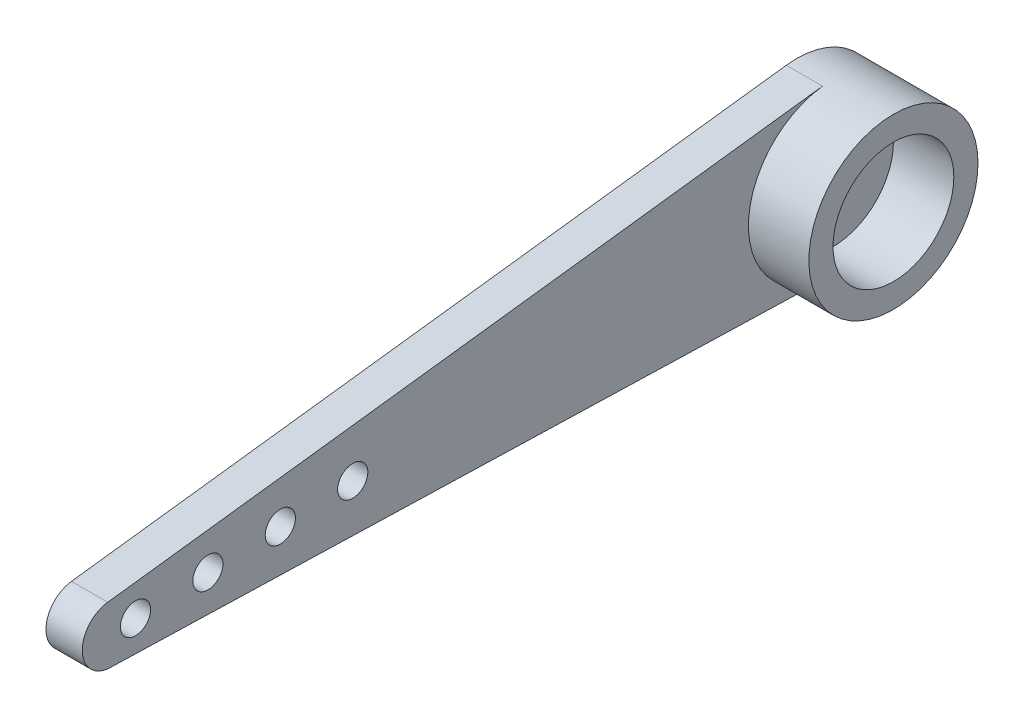
ISO-10303-21;
HEADER;
FILE_DESCRIPTION(('STEP AP214'),'2;1');
FILE_NAME('part.step','',(''),(''),'','','');
FILE_SCHEMA(('AUTOMOTIVE_DESIGN { 1 0 10303 214 1 1 1 1 }'));
ENDSEC;
DATA;
#1=APPLICATION_CONTEXT('core data for automotive mechanical design processes');
#2=APPLICATION_PROTOCOL_DEFINITION('international standard','automotive_design',2000,#1);
#3=PRODUCT_CONTEXT('',#1,'mechanical');
#4=PRODUCT('Part','Part','',(#3));
#5=PRODUCT_RELATED_PRODUCT_CATEGORY('part','',(#4));
#6=PRODUCT_DEFINITION_FORMATION('','',#4);
#7=PRODUCT_DEFINITION_CONTEXT('part definition',#1,'design');
#8=PRODUCT_DEFINITION('design','',#6,#7);
#9=PRODUCT_DEFINITION_SHAPE('','',#8);
#10=(LENGTH_UNIT() NAMED_UNIT(*) SI_UNIT(.MILLI.,.METRE.));
#11=(NAMED_UNIT(*) PLANE_ANGLE_UNIT() SI_UNIT($,.RADIAN.));
#12=(NAMED_UNIT(*) SI_UNIT($,.STERADIAN.) SOLID_ANGLE_UNIT());
#13=UNCERTAINTY_MEASURE_WITH_UNIT(LENGTH_MEASURE(1.E-05),#10,'distance_accuracy_value','');
#14=(GEOMETRIC_REPRESENTATION_CONTEXT(3) GLOBAL_UNCERTAINTY_ASSIGNED_CONTEXT((#13)) GLOBAL_UNIT_ASSIGNED_CONTEXT((#10,
#11,#12)) REPRESENTATION_CONTEXT('',''));
#15=CARTESIAN_POINT('',(0.,0.,0.));
#16=DIRECTION('',(0.,0.,1.));
#17=DIRECTION('',(1.,0.,0.));
#18=AXIS2_PLACEMENT_3D('',#15,#16,#17);
#19=CARTESIAN_POINT('',(32.7710882546416,5.20649712537169,-71.7326396745928));
#20=DIRECTION('',(0.,-0.999572249893803,0.0292458072591791));
#21=DIRECTION('',(0.,-0.0292458072591791,-0.999572249893803));
#22=AXIS2_PLACEMENT_3D('',#19,#20,#21);
#23=PLANE('',#22);
#24=DIRECTION('',(0.,-0.0292458072591791,-0.999572249893803));
#25=VECTOR('',#24,1.);
#26=CARTESIAN_POINT('',(-2.5,5.20649712537169,-71.7326396745928));
#27=LINE('',#26,#25);
#28=CARTESIAN_POINT('',(-2.5,6.08166145135119,-41.8210025433743));
#29=VERTEX_POINT('',#28);
#30=CARTESIAN_POINT('',(-2.5,5.20649712537169,-71.7326396745928));
#31=VERTEX_POINT('',#30);
#32=EDGE_CURVE('E94',#29,#31,#27,.T.);
#33=ORIENTED_EDGE('',*,*,#32,.F.);
#34=DIRECTION('',(-1.,0.,0.));
#35=VECTOR('',#34,1.);
#36=CARTESIAN_POINT('',(32.7710882546416,6.08166145135119,-41.8210025433743));
#37=LINE('',#36,#35);
#38=CARTESIAN_POINT('',(-4.,6.08166145135119,-41.8210025433743));
#39=VERTEX_POINT('',#38);
#40=EDGE_CURVE('E144',#29,#39,#37,.T.);
#41=ORIENTED_EDGE('',*,*,#40,.T.);
#42=DIRECTION('',(0.,0.0292458072591791,0.999572249893803));
#43=VECTOR('',#42,1.);
#44=CARTESIAN_POINT('',(-4.,5.20649712537169,-71.7326396745928));
#45=LINE('',#44,#43);
#46=CARTESIAN_POINT('',(-4.,5.20649712537169,-71.7326396745928));
#47=VERTEX_POINT('',#46);
#48=EDGE_CURVE('E134',#47,#39,#45,.T.);
#49=ORIENTED_EDGE('',*,*,#48,.F.);
#50=DIRECTION('',(-1.,0.,0.));
#51=VECTOR('',#50,1.);
#52=CARTESIAN_POINT('',(32.7710882546416,5.20649712537169,-71.7326396745928));
#53=LINE('',#52,#51);
#54=EDGE_CURVE('E141',#31,#47,#53,.T.);
#55=ORIENTED_EDGE('',*,*,#54,.F.);
#56=EDGE_LOOP('',(#33,#41,#49,#55));
#57=FACE_BOUND('',#56,.T.);
#58=ADVANCED_FACE('F41',(#57),#23,.T.);
#59=CARTESIAN_POINT('',(32.7710882546416,7.27675693693088,-41.9698372006076));
#60=DIRECTION('',(-1.,0.,0.));
#61=DIRECTION('',(0.,0.,1.));
#62=AXIS2_PLACEMENT_3D('',#59,#60,#61);
#63=CYLINDRICAL_SURFACE('',#62,1.20432760279199);
#64=CARTESIAN_POINT('',(-2.5,7.27675693693088,-41.9698372006076));
#65=DIRECTION('',(-1.,0.,0.));
#66=DIRECTION('',(0.,0.,1.));
#67=AXIS2_PLACEMENT_3D('',#64,#65,#66);
#68=CIRCLE('',#67,1.20432760279199);
#69=CARTESIAN_POINT('',(-2.5,8.47174158743079,-41.8201152586074));
#70=VERTEX_POINT('',#69);
#71=EDGE_CURVE('E89',#70,#29,#68,.F.);
#72=ORIENTED_EDGE('',*,*,#71,.F.);
#73=DIRECTION('',(-1.,0.,0.));
#74=VECTOR('',#73,1.);
#75=CARTESIAN_POINT('',(32.7710882546416,8.47174158743079,-41.8201152586074));
#76=LINE('',#75,#74);
#77=CARTESIAN_POINT('',(-4.,8.47174158743079,-41.8201152586074));
#78=VERTEX_POINT('',#77);
#79=EDGE_CURVE('E90',#70,#78,#76,.T.);
#80=ORIENTED_EDGE('',*,*,#79,.T.);
#81=CARTESIAN_POINT('',(-4.,7.27675693693088,-41.9698372006076));
#82=DIRECTION('',(-1.,0.,0.));
#83=DIRECTION('',(0.,0.,-1.));
#84=AXIS2_PLACEMENT_3D('',#81,#82,#83);
#85=CIRCLE('',#84,1.20432760279199);
#86=EDGE_CURVE('E137',#39,#78,#85,.T.);
#87=ORIENTED_EDGE('',*,*,#86,.F.);
#88=ORIENTED_EDGE('',*,*,#40,.F.);
#89=EDGE_LOOP('',(#72,#80,#87,#88));
#90=FACE_BOUND('',#89,.T.);
#91=ADVANCED_FACE('F178',(#90),#63,.T.);
#92=CARTESIAN_POINT('',(32.7710882546416,12.1778476429948,-71.3998801905846));
#93=DIRECTION('',(0.,0.992242183712791,0.124319945547254));
#94=DIRECTION('',(0.,-0.124319945547254,0.992242183712791));
#95=AXIS2_PLACEMENT_3D('',#92,#93,#94);
#96=PLANE('',#95);
#97=DIRECTION('',(0.,-0.124319945547254,0.992242183712791));
#98=VECTOR('',#97,1.);
#99=CARTESIAN_POINT('',(-2.5,12.1778476429948,-71.3998801905846));
#100=LINE('',#99,#98);
#101=CARTESIAN_POINT('',(-2.5,12.1778476429948,-71.3998801905846));
#102=VERTEX_POINT('',#101);
#103=EDGE_CURVE('E58',#102,#70,#100,.T.);
#104=ORIENTED_EDGE('',*,*,#103,.F.);
#105=DIRECTION('',(-1.,0.,0.));
#106=VECTOR('',#105,1.);
#107=CARTESIAN_POINT('',(32.7710882546416,12.1778476429948,-71.3998801905846));
#108=LINE('',#107,#106);
#109=CARTESIAN_POINT('',(-4.,12.1778476429948,-71.3998801905846));
#110=VERTEX_POINT('',#109);
#111=EDGE_CURVE('E81',#102,#110,#108,.T.);
#112=ORIENTED_EDGE('',*,*,#111,.T.);
#113=DIRECTION('',(0.,0.124319945547254,-0.992242183712791));
#114=VECTOR('',#113,1.);
#115=CARTESIAN_POINT('',(-4.,12.1778476429948,-71.3998801905846));
#116=LINE('',#115,#114);
#117=EDGE_CURVE('E140',#78,#110,#116,.T.);
#118=ORIENTED_EDGE('',*,*,#117,.F.);
#119=ORIENTED_EDGE('',*,*,#79,.F.);
#120=EDGE_LOOP('',(#104,#112,#118,#119));
#121=FACE_BOUND('',#120,.T.);
#122=ADVANCED_FACE('F93',(#121),#96,.T.);
#123=CARTESIAN_POINT('',(32.7710882546416,8.70499999999999,-71.835));
#124=DIRECTION('',(-1.,0.,0.));
#125=DIRECTION('',(0.,0.,1.));
#126=AXIS2_PLACEMENT_3D('',#123,#124,#125);
#127=CYLINDRICAL_SURFACE('',#126,3.49999999999999);
#128=ORIENTED_EDGE('',*,*,#111,.F.);
#129=CARTESIAN_POINT('',(-2.5,8.70499999999999,-71.835));
#130=DIRECTION('',(1.,0.,0.));
#131=DIRECTION('',(0.,0.,-1.));
#132=AXIS2_PLACEMENT_3D('',#129,#130,#131);
#133=CIRCLE('',#132,3.49999999999999);
#134=EDGE_CURVE('E83',#102,#31,#133,.T.);
#135=ORIENTED_EDGE('',*,*,#134,.T.);
#136=ORIENTED_EDGE('',*,*,#54,.T.);
#137=CARTESIAN_POINT('',(-4.,8.70499999999999,-71.835));
#138=DIRECTION('',(-1.,0.,0.));
#139=DIRECTION('',(0.,0.,1.));
#140=AXIS2_PLACEMENT_3D('',#137,#138,#139);
#141=CIRCLE('',#140,3.49999999999999);
#142=EDGE_CURVE('E85',#110,#47,#141,.T.);
#143=ORIENTED_EDGE('',*,*,#142,.F.);
#144=EDGE_LOOP('',(#128,#135,#136,#143));
#145=FACE_BOUND('',#144,.T.);
#146=CARTESIAN_POINT('',(0.,8.70499999999999,-71.835));
#147=DIRECTION('',(1.,0.,0.));
#148=DIRECTION('',(0.,0.,-1.));
#149=AXIS2_PLACEMENT_3D('',#146,#147,#148);
#150=CIRCLE('',#149,3.49999999999999);
#151=CARTESIAN_POINT('',(0.,8.70499999999999,-75.335));
#152=VERTEX_POINT('',#151);
#153=EDGE_CURVE('E101',#152,#152,#150,.T.);
#154=ORIENTED_EDGE('',*,*,#153,.F.);
#155=EDGE_LOOP('',(#154));
#156=FACE_BOUND('',#155,.T.);
#157=ADVANCED_FACE('F43',(#145,#156),#127,.T.);
#158=CARTESIAN_POINT('',(32.7710882546416,7.46783074979835,-45.9652709440247));
#159=DIRECTION('',(-1.,0.,0.));
#160=DIRECTION('',(0.,0.,1.));
#161=AXIS2_PLACEMENT_3D('',#158,#159,#160);
#162=CYLINDRICAL_SURFACE('',#161,0.624999999999999);
#163=CARTESIAN_POINT('',(-2.5,7.46783074979835,-45.9652709440247));
#164=DIRECTION('',(-1.,0.,0.));
#165=DIRECTION('',(0.,0.,1.));
#166=AXIS2_PLACEMENT_3D('',#163,#164,#165);
#167=CIRCLE('',#166,0.624999999999999);
#168=CARTESIAN_POINT('',(-2.5,7.46783074979835,-45.3402709440247));
#169=VERTEX_POINT('',#168);
#170=EDGE_CURVE('E11',#169,#169,#167,.F.);
#171=ORIENTED_EDGE('',*,*,#170,.T.);
#172=EDGE_LOOP('',(#171));
#173=FACE_BOUND('',#172,.T.);
#174=CARTESIAN_POINT('',(-4.,7.46783074979835,-45.9652709440247));
#175=DIRECTION('',(-1.,0.,0.));
#176=DIRECTION('',(0.,0.,1.));
#177=AXIS2_PLACEMENT_3D('',#174,#175,#176);
#178=CIRCLE('',#177,0.624999999999999);
#179=CARTESIAN_POINT('',(-4.,7.46783074979835,-45.3402709440247));
#180=VERTEX_POINT('',#179);
#181=EDGE_CURVE('E130',#180,#180,#178,.T.);
#182=ORIENTED_EDGE('',*,*,#181,.T.);
#183=EDGE_LOOP('',(#182));
#184=FACE_BOUND('',#183,.T.);
#185=ADVANCED_FACE('F161',(#173,#184),#162,.F.);
#186=CARTESIAN_POINT('',(32.7710882546416,7.61113610944896,-48.9618462515876));
#187=DIRECTION('',(-1.,0.,0.));
#188=DIRECTION('',(0.,0.,1.));
#189=AXIS2_PLACEMENT_3D('',#186,#187,#188);
#190=CYLINDRICAL_SURFACE('',#189,0.624999999999999);
#191=CARTESIAN_POINT('',(-2.5,7.61113610944896,-48.9618462515876));
#192=DIRECTION('',(-1.,0.,0.));
#193=DIRECTION('',(0.,0.,1.));
#194=AXIS2_PLACEMENT_3D('',#191,#192,#193);
#195=CIRCLE('',#194,0.624999999999999);
#196=CARTESIAN_POINT('',(-2.5,7.61113610944896,-48.3368462515876));
#197=VERTEX_POINT('',#196);
#198=EDGE_CURVE('E117',#197,#197,#195,.F.);
#199=ORIENTED_EDGE('',*,*,#198,.T.);
#200=EDGE_LOOP('',(#199));
#201=FACE_BOUND('',#200,.T.);
#202=CARTESIAN_POINT('',(-4.,7.61113610944896,-48.9618462515876));
#203=DIRECTION('',(-1.,0.,0.));
#204=DIRECTION('',(0.,0.,1.));
#205=AXIS2_PLACEMENT_3D('',#202,#203,#204);
#206=CIRCLE('',#205,0.624999999999999);
#207=CARTESIAN_POINT('',(-4.,7.61113610944896,-48.3368462515876));
#208=VERTEX_POINT('',#207);
#209=EDGE_CURVE('E127',#208,#208,#206,.T.);
#210=ORIENTED_EDGE('',*,*,#209,.T.);
#211=EDGE_LOOP('',(#210));
#212=FACE_BOUND('',#211,.T.);
#213=ADVANCED_FACE('F164',(#201,#212),#190,.F.);
#214=CARTESIAN_POINT('',(32.7710882546416,7.75444146909957,-51.9584215591504));
#215=DIRECTION('',(-1.,0.,0.));
#216=DIRECTION('',(0.,0.,1.));
#217=AXIS2_PLACEMENT_3D('',#214,#215,#216);
#218=CYLINDRICAL_SURFACE('',#217,0.624999999999999);
#219=CARTESIAN_POINT('',(-2.5,7.75444146909957,-51.9584215591504));
#220=DIRECTION('',(-1.,0.,0.));
#221=DIRECTION('',(0.,0.,1.));
#222=AXIS2_PLACEMENT_3D('',#219,#220,#221);
#223=CIRCLE('',#222,0.624999999999999);
#224=CARTESIAN_POINT('',(-2.5,7.75444146909957,-51.3334215591504));
#225=VERTEX_POINT('',#224);
#226=EDGE_CURVE('E51',#225,#225,#223,.F.);
#227=ORIENTED_EDGE('',*,*,#226,.T.);
#228=EDGE_LOOP('',(#227));
#229=FACE_BOUND('',#228,.T.);
#230=CARTESIAN_POINT('',(-4.,7.75444146909957,-51.9584215591504));
#231=DIRECTION('',(-1.,0.,0.));
#232=DIRECTION('',(0.,0.,1.));
#233=AXIS2_PLACEMENT_3D('',#230,#231,#232);
#234=CIRCLE('',#233,0.624999999999999);
#235=CARTESIAN_POINT('',(-4.,7.75444146909957,-51.3334215591504));
#236=VERTEX_POINT('',#235);
#237=EDGE_CURVE('E124',#236,#236,#234,.T.);
#238=ORIENTED_EDGE('',*,*,#237,.T.);
#239=EDGE_LOOP('',(#238));
#240=FACE_BOUND('',#239,.T.);
#241=ADVANCED_FACE('F171',(#229,#240),#218,.F.);
#242=CARTESIAN_POINT('',(-4.,8.70499999999999,-71.835));
#243=DIRECTION('',(-1.,0.,0.));
#244=DIRECTION('',(0.,0.,1.));
#245=AXIS2_PLACEMENT_3D('',#242,#243,#244);
#246=PLANE('',#245);
#247=CARTESIAN_POINT('',(-4.,8.70499999999999,-71.835));
#248=DIRECTION('',(-1.,0.,0.));
#249=DIRECTION('',(0.,0.,1.));
#250=AXIS2_PLACEMENT_3D('',#247,#248,#249);
#251=CIRCLE('',#250,2.5);
#252=CARTESIAN_POINT('',(-4.,8.70499999999999,-69.335));
#253=VERTEX_POINT('',#252);
#254=EDGE_CURVE('E224',#253,#253,#251,.T.);
#255=ORIENTED_EDGE('',*,*,#254,.F.);
#256=EDGE_LOOP('',(#255));
#257=FACE_BOUND('',#256,.T.);
#258=CARTESIAN_POINT('',(-4.,7.32452539014775,-42.9686956364619));
#259=DIRECTION('',(-1.,0.,0.));
#260=DIRECTION('',(0.,0.,1.));
#261=AXIS2_PLACEMENT_3D('',#258,#259,#260);
#262=CIRCLE('',#261,0.624999999999999);
#263=CARTESIAN_POINT('',(-4.,7.32452539014775,-42.3436956364619));
#264=VERTEX_POINT('',#263);
#265=EDGE_CURVE('E113',#264,#264,#262,.T.);
#266=ORIENTED_EDGE('',*,*,#265,.F.);
#267=EDGE_LOOP('',(#266));
#268=FACE_BOUND('',#267,.T.);
#269=ORIENTED_EDGE('',*,*,#237,.F.);
#270=EDGE_LOOP('',(#269));
#271=FACE_BOUND('',#270,.T.);
#272=ORIENTED_EDGE('',*,*,#209,.F.);
#273=EDGE_LOOP('',(#272));
#274=FACE_BOUND('',#273,.T.);
#275=ORIENTED_EDGE('',*,*,#181,.F.);
#276=EDGE_LOOP('',(#275));
#277=FACE_BOUND('',#276,.T.);
#278=ORIENTED_EDGE('',*,*,#142,.T.);
#279=ORIENTED_EDGE('',*,*,#48,.T.);
#280=ORIENTED_EDGE('',*,*,#86,.T.);
#281=ORIENTED_EDGE('',*,*,#117,.T.);
#282=EDGE_LOOP('',(#278,#279,#280,#281));
#283=FACE_BOUND('',#282,.T.);
#284=ADVANCED_FACE('F168',(#257,#268,#271,#274,#277,#283),#246,.T.);
#285=CARTESIAN_POINT('',(32.7710882546416,7.32452539014775,-42.9686956364619));
#286=DIRECTION('',(-1.,0.,0.));
#287=DIRECTION('',(0.,0.,1.));
#288=AXIS2_PLACEMENT_3D('',#285,#286,#287);
#289=CYLINDRICAL_SURFACE('',#288,0.624999999999999);
#290=CARTESIAN_POINT('',(-2.5,7.32452539014775,-42.9686956364619));
#291=DIRECTION('',(-1.,0.,0.));
#292=DIRECTION('',(0.,0.,1.));
#293=AXIS2_PLACEMENT_3D('',#290,#291,#292);
#294=CIRCLE('',#293,0.624999999999999);
#295=CARTESIAN_POINT('',(-2.5,7.32452539014775,-42.3436956364619));
#296=VERTEX_POINT('',#295);
#297=EDGE_CURVE('E116',#296,#296,#294,.F.);
#298=ORIENTED_EDGE('',*,*,#297,.T.);
#299=EDGE_LOOP('',(#298));
#300=FACE_BOUND('',#299,.T.);
#301=ORIENTED_EDGE('',*,*,#265,.T.);
#302=EDGE_LOOP('',(#301));
#303=FACE_BOUND('',#302,.T.);
#304=ADVANCED_FACE('F149',(#300,#303),#289,.F.);
#305=CARTESIAN_POINT('',(-2.5,8.09582914462203,-56.9474578634027));
#306=DIRECTION('',(-1.,0.,0.));
#307=DIRECTION('',(0.,0.999163901785049,0.0408839500253666));
#308=AXIS2_PLACEMENT_3D('',#305,#306,#307);
#309=PLANE('',#308);
#310=ORIENTED_EDGE('',*,*,#134,.F.);
#311=ORIENTED_EDGE('',*,*,#103,.T.);
#312=ORIENTED_EDGE('',*,*,#71,.T.);
#313=ORIENTED_EDGE('',*,*,#32,.T.);
#314=EDGE_LOOP('',(#310,#311,#312,#313));
#315=FACE_BOUND('',#314,.T.);
#316=ORIENTED_EDGE('',*,*,#198,.F.);
#317=EDGE_LOOP('',(#316));
#318=FACE_BOUND('',#317,.T.);
#319=ORIENTED_EDGE('',*,*,#297,.F.);
#320=EDGE_LOOP('',(#319));
#321=FACE_BOUND('',#320,.T.);
#322=ORIENTED_EDGE('',*,*,#226,.F.);
#323=EDGE_LOOP('',(#322));
#324=FACE_BOUND('',#323,.T.);
#325=ORIENTED_EDGE('',*,*,#170,.F.);
#326=EDGE_LOOP('',(#325));
#327=FACE_BOUND('',#326,.T.);
#328=ADVANCED_FACE('F96',(#315,#318,#321,#324,#327),#309,.F.);
#329=CARTESIAN_POINT('',(0.,8.70499999999999,-71.835));
#330=DIRECTION('',(1.,0.,0.));
#331=DIRECTION('',(0.,-0.999163901785049,-0.0408839500253666));
#332=AXIS2_PLACEMENT_3D('',#329,#330,#331);
#333=PLANE('',#332);
#334=CARTESIAN_POINT('',(0.,8.70499999999999,-71.835));
#335=DIRECTION('',(1.,0.,0.));
#336=DIRECTION('',(0.,0.,-1.));
#337=AXIS2_PLACEMENT_3D('',#334,#335,#336);
#338=CIRCLE('',#337,2.50000000000001);
#339=CARTESIAN_POINT('',(0.,8.70499999999999,-74.335));
#340=VERTEX_POINT('',#339);
#341=EDGE_CURVE('E104',#340,#340,#338,.T.);
#342=ORIENTED_EDGE('',*,*,#341,.F.);
#343=EDGE_LOOP('',(#342));
#344=FACE_BOUND('',#343,.T.);
#345=ORIENTED_EDGE('',*,*,#153,.T.);
#346=EDGE_LOOP('',(#345));
#347=FACE_BOUND('',#346,.T.);
#348=ADVANCED_FACE('F154',(#344,#347),#333,.T.);
#349=CARTESIAN_POINT('',(9.89949493661164,8.70499999999999,-71.835));
#350=DIRECTION('',(-1.,0.,0.));
#351=DIRECTION('',(0.,0.,1.));
#352=AXIS2_PLACEMENT_3D('',#349,#350,#351);
#353=CYLINDRICAL_SURFACE('',#352,2.50000000000001);
#354=CARTESIAN_POINT('',(-2.5,8.70499999999999,-71.835));
#355=DIRECTION('',(1.,0.,0.));
#356=DIRECTION('',(0.,0.,-1.));
#357=AXIS2_PLACEMENT_3D('',#354,#355,#356);
#358=CIRCLE('',#357,2.50000000000001);
#359=CARTESIAN_POINT('',(-2.5,8.70499999999999,-74.335));
#360=VERTEX_POINT('',#359);
#361=EDGE_CURVE('E100',#360,#360,#358,.T.);
#362=ORIENTED_EDGE('',*,*,#361,.F.);
#363=EDGE_LOOP('',(#362));
#364=FACE_BOUND('',#363,.T.);
#365=ORIENTED_EDGE('',*,*,#341,.T.);
#366=EDGE_LOOP('',(#365));
#367=FACE_BOUND('',#366,.T.);
#368=ADVANCED_FACE('F199',(#364,#367),#353,.F.);
#369=CARTESIAN_POINT('',(-2.5,8.70499999999999,-71.835));
#370=DIRECTION('',(-1.,0.,0.));
#371=DIRECTION('',(0.,0.,1.));
#372=AXIS2_PLACEMENT_3D('',#369,#370,#371);
#373=CIRCLE('',#372,0.999999999999998);
#374=CARTESIAN_POINT('',(-2.5,8.70499999999999,-70.835));
#375=VERTEX_POINT('',#374);
#376=EDGE_CURVE('E222',#375,#375,#373,.T.);
#377=ORIENTED_EDGE('',*,*,#376,.T.);
#378=EDGE_LOOP('',(#377));
#379=FACE_BOUND('',#378,.T.);
#380=ORIENTED_EDGE('',*,*,#361,.T.);
#381=EDGE_LOOP('',(#380));
#382=FACE_BOUND('',#381,.T.);
#383=ADVANCED_FACE('F156',(#379,#382),#309,.F.);
#384=CARTESIAN_POINT('',(-3.4,8.70499999999999,-71.835));
#385=DIRECTION('',(-1.,0.,0.));
#386=DIRECTION('',(0.,0.,1.));
#387=AXIS2_PLACEMENT_3D('',#384,#385,#386);
#388=CYLINDRICAL_SURFACE('',#387,2.5);
#389=CARTESIAN_POINT('',(-3.4,8.70499999999999,-71.835));
#390=DIRECTION('',(-1.,0.,0.));
#391=DIRECTION('',(0.,0.,1.));
#392=AXIS2_PLACEMENT_3D('',#389,#390,#391);
#393=CIRCLE('',#392,2.5);
#394=CARTESIAN_POINT('',(-3.4,8.70499999999999,-69.335));
#395=VERTEX_POINT('',#394);
#396=EDGE_CURVE('E107',#395,#395,#393,.T.);
#397=ORIENTED_EDGE('',*,*,#396,.F.);
#398=EDGE_LOOP('',(#397));
#399=FACE_BOUND('',#398,.T.);
#400=ORIENTED_EDGE('',*,*,#254,.T.);
#401=EDGE_LOOP('',(#400));
#402=FACE_BOUND('',#401,.T.);
#403=ADVANCED_FACE('F204',(#399,#402),#388,.F.);
#404=CARTESIAN_POINT('',(-3.4,8.70499999999999,-71.835));
#405=DIRECTION('',(-1.,0.,0.));
#406=DIRECTION('',(0.,0.,1.));
#407=AXIS2_PLACEMENT_3D('',#404,#405,#406);
#408=PLANE('',#407);
#409=CARTESIAN_POINT('',(-3.4,8.70499999999999,-71.835));
#410=DIRECTION('',(-1.,0.,0.));
#411=DIRECTION('',(0.,0.,1.));
#412=AXIS2_PLACEMENT_3D('',#409,#410,#411);
#413=CIRCLE('',#412,0.999999999999998);
#414=CARTESIAN_POINT('',(-3.4,8.70499999999999,-70.835));
#415=VERTEX_POINT('',#414);
#416=EDGE_CURVE('E45',#415,#415,#413,.T.);
#417=ORIENTED_EDGE('',*,*,#416,.F.);
#418=EDGE_LOOP('',(#417));
#419=FACE_BOUND('',#418,.T.);
#420=ORIENTED_EDGE('',*,*,#396,.T.);
#421=EDGE_LOOP('',(#420));
#422=FACE_BOUND('',#421,.T.);
#423=ADVANCED_FACE('F207',(#419,#422),#408,.T.);
#424=CARTESIAN_POINT('',(0.,8.70499999999999,-71.835));
#425=DIRECTION('',(-1.,0.,0.));
#426=DIRECTION('',(0.,0.,1.));
#427=AXIS2_PLACEMENT_3D('',#424,#425,#426);
#428=CYLINDRICAL_SURFACE('',#427,0.999999999999998);
#429=ORIENTED_EDGE('',*,*,#416,.T.);
#430=EDGE_LOOP('',(#429));
#431=FACE_BOUND('',#430,.T.);
#432=ORIENTED_EDGE('',*,*,#376,.F.);
#433=EDGE_LOOP('',(#432));
#434=FACE_BOUND('',#433,.T.);
#435=ADVANCED_FACE('F211',(#431,#434),#428,.F.);
#436=CLOSED_SHELL('',(#58,#91,#122,#157,#185,#213,#241,#284,#304,#328,#348,#368,#383,#403,#423,#435));
#437=MANIFOLD_SOLID_BREP('B2',#436);
#438=ADVANCED_BREP_SHAPE_REPRESENTATION('',(#18,#437),#14);
#439=SHAPE_DEFINITION_REPRESENTATION(#9,#438);
ENDSEC;
END-ISO-10303-21;
